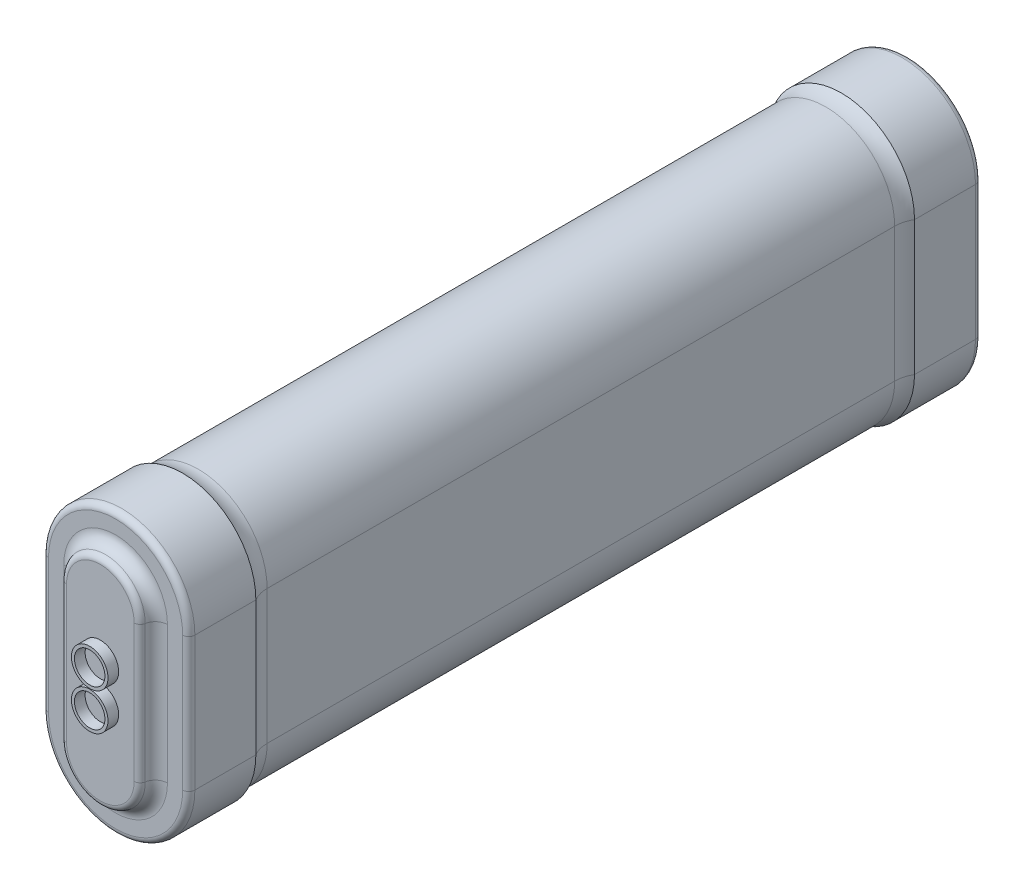
ISO-10303-21;
HEADER;
FILE_DESCRIPTION(('STEP AP214'),'2;1');
FILE_NAME('part.step','',(''),(''),'','','');
FILE_SCHEMA(('AUTOMOTIVE_DESIGN { 1 0 10303 214 1 1 1 1 }'));
ENDSEC;
DATA;
#1=APPLICATION_CONTEXT('core data for automotive mechanical design processes');
#2=APPLICATION_PROTOCOL_DEFINITION('international standard','automotive_design',2000,#1);
#3=PRODUCT_CONTEXT('',#1,'mechanical');
#4=PRODUCT('Part','Part','',(#3));
#5=PRODUCT_RELATED_PRODUCT_CATEGORY('part','',(#4));
#6=PRODUCT_DEFINITION_FORMATION('','',#4);
#7=PRODUCT_DEFINITION_CONTEXT('part definition',#1,'design');
#8=PRODUCT_DEFINITION('design','',#6,#7);
#9=PRODUCT_DEFINITION_SHAPE('','',#8);
#10=(LENGTH_UNIT() NAMED_UNIT(*) SI_UNIT(.MILLI.,.METRE.));
#11=(NAMED_UNIT(*) PLANE_ANGLE_UNIT() SI_UNIT($,.RADIAN.));
#12=(NAMED_UNIT(*) SI_UNIT($,.STERADIAN.) SOLID_ANGLE_UNIT());
#13=UNCERTAINTY_MEASURE_WITH_UNIT(LENGTH_MEASURE(1.E-05),#10,'distance_accuracy_value','');
#14=(GEOMETRIC_REPRESENTATION_CONTEXT(3) GLOBAL_UNCERTAINTY_ASSIGNED_CONTEXT((#13)) GLOBAL_UNIT_ASSIGNED_CONTEXT((#10,
#11,#12)) REPRESENTATION_CONTEXT('',''));
#15=CARTESIAN_POINT('',(0.,0.,0.));
#16=DIRECTION('',(0.,0.,1.));
#17=DIRECTION('',(1.,0.,0.));
#18=AXIS2_PLACEMENT_3D('',#15,#16,#17);
#19=CARTESIAN_POINT('',(0.,-11.25,67.5));
#20=DIRECTION('',(0.,0.,-1.));
#21=DIRECTION('',(-1.,0.,0.));
#22=AXIS2_PLACEMENT_3D('',#19,#20,#21);
#23=PLANE('',#22);
#24=CARTESIAN_POINT('',(0.,11.25,67.5));
#25=DIRECTION('',(0.,0.,-1.));
#26=DIRECTION('',(-1.,0.,0.));
#27=AXIS2_PLACEMENT_3D('',#24,#25,#26);
#28=CIRCLE('',#27,5.54196010845019);
#29=CARTESIAN_POINT('',(5.54196010845019,11.25,67.5));
#30=VERTEX_POINT('',#29);
#31=CARTESIAN_POINT('',(-5.54196010845019,11.25,67.5));
#32=VERTEX_POINT('',#31);
#33=EDGE_CURVE('E342',#30,#32,#28,.F.);
#34=ORIENTED_EDGE('',*,*,#33,.T.);
#35=DIRECTION('',(0.,1.,0.));
#36=VECTOR('',#35,1.);
#37=CARTESIAN_POINT('',(-5.54196010845019,-11.25,67.5));
#38=LINE('',#37,#36);
#39=CARTESIAN_POINT('',(-5.54196010845019,-11.25,67.5));
#40=VERTEX_POINT('',#39);
#41=EDGE_CURVE('E344',#32,#40,#38,.F.);
#42=ORIENTED_EDGE('',*,*,#41,.T.);
#43=CARTESIAN_POINT('',(0.,-11.25,67.5));
#44=DIRECTION('',(0.,0.,-1.));
#45=DIRECTION('',(-1.,0.,0.));
#46=AXIS2_PLACEMENT_3D('',#43,#44,#45);
#47=CIRCLE('',#46,5.54196010845019);
#48=CARTESIAN_POINT('',(5.54196010845019,-11.25,67.5));
#49=VERTEX_POINT('',#48);
#50=EDGE_CURVE('E329',#40,#49,#47,.F.);
#51=ORIENTED_EDGE('',*,*,#50,.T.);
#52=DIRECTION('',(0.,-1.,0.));
#53=VECTOR('',#52,1.);
#54=CARTESIAN_POINT('',(5.54196010845019,-11.25,67.5));
#55=LINE('',#54,#53);
#56=EDGE_CURVE('E340',#49,#30,#55,.F.);
#57=ORIENTED_EDGE('',*,*,#56,.T.);
#58=EDGE_LOOP('',(#34,#42,#51,#57));
#59=FACE_BOUND('',#58,.T.);
#60=CARTESIAN_POINT('',(0.,3.05,67.5));
#61=DIRECTION('',(0.,0.,-1.));
#62=DIRECTION('',(-1.,0.,0.));
#63=AXIS2_PLACEMENT_3D('',#60,#61,#62);
#64=CIRCLE('',#63,3.);
#65=CARTESIAN_POINT('',(-3.,3.05,67.5));
#66=VERTEX_POINT('',#65);
#67=EDGE_CURVE('E40',#66,#66,#64,.F.);
#68=ORIENTED_EDGE('',*,*,#67,.F.);
#69=EDGE_LOOP('',(#68));
#70=FACE_BOUND('',#69,.T.);
#71=CARTESIAN_POINT('',(0.,-3.05,67.5));
#72=DIRECTION('',(0.,0.,-1.));
#73=DIRECTION('',(-1.,0.,0.));
#74=AXIS2_PLACEMENT_3D('',#71,#72,#73);
#75=CIRCLE('',#74,3.);
#76=CARTESIAN_POINT('',(-3.,-3.05,67.5));
#77=VERTEX_POINT('',#76);
#78=EDGE_CURVE('E11',#77,#77,#75,.F.);
#79=ORIENTED_EDGE('',*,*,#78,.F.);
#80=EDGE_LOOP('',(#79));
#81=FACE_BOUND('',#80,.T.);
#82=ADVANCED_FACE('F32',(#59,#70,#81),#23,.F.);
#83=CARTESIAN_POINT('',(0.,-11.,65.));
#84=DIRECTION('',(0.,0.,-1.));
#85=DIRECTION('',(-1.,0.,0.));
#86=AXIS2_PLACEMENT_3D('',#83,#84,#85);
#87=PLANE('',#86);
#88=CARTESIAN_POINT('',(0.,-11.25,65.));
#89=DIRECTION('',(0.,0.,-1.));
#90=DIRECTION('',(-1.,0.,0.));
#91=AXIS2_PLACEMENT_3D('',#88,#89,#90);
#92=CIRCLE('',#91,8.5);
#93=CARTESIAN_POINT('',(8.5,-11.25,65.));
#94=VERTEX_POINT('',#93);
#95=CARTESIAN_POINT('',(-8.5,-11.25,65.));
#96=VERTEX_POINT('',#95);
#97=EDGE_CURVE('E324',#94,#96,#92,.T.);
#98=ORIENTED_EDGE('',*,*,#97,.T.);
#99=DIRECTION('',(0.,-1.,0.));
#100=VECTOR('',#99,1.);
#101=CARTESIAN_POINT('',(-8.5,11.25,65.));
#102=LINE('',#101,#100);
#103=CARTESIAN_POINT('',(-8.5,11.25,65.));
#104=VERTEX_POINT('',#103);
#105=EDGE_CURVE('E326',#96,#104,#102,.F.);
#106=ORIENTED_EDGE('',*,*,#105,.T.);
#107=CARTESIAN_POINT('',(0.,11.25,65.));
#108=DIRECTION('',(0.,0.,-1.));
#109=DIRECTION('',(-1.,0.,0.));
#110=AXIS2_PLACEMENT_3D('',#107,#108,#109);
#111=CIRCLE('',#110,8.5);
#112=CARTESIAN_POINT('',(8.5,11.25,65.));
#113=VERTEX_POINT('',#112);
#114=EDGE_CURVE('E321',#104,#113,#111,.T.);
#115=ORIENTED_EDGE('',*,*,#114,.T.);
#116=DIRECTION('',(0.,1.,0.));
#117=VECTOR('',#116,1.);
#118=CARTESIAN_POINT('',(8.5,-11.25,65.));
#119=LINE('',#118,#117);
#120=EDGE_CURVE('E299',#113,#94,#119,.F.);
#121=ORIENTED_EDGE('',*,*,#120,.T.);
#122=EDGE_LOOP('',(#98,#106,#115,#121));
#123=FACE_BOUND('',#122,.T.);
#124=CARTESIAN_POINT('',(0.,11.,65.));
#125=DIRECTION('',(0.,0.,-1.));
#126=DIRECTION('',(-1.,0.,0.));
#127=AXIS2_PLACEMENT_3D('',#124,#125,#126);
#128=CIRCLE('',#127,11.);
#129=CARTESIAN_POINT('',(11.,11.,65.));
#130=VERTEX_POINT('',#129);
#131=CARTESIAN_POINT('',(-11.,11.,65.));
#132=VERTEX_POINT('',#131);
#133=EDGE_CURVE('E283',#130,#132,#128,.F.);
#134=ORIENTED_EDGE('',*,*,#133,.T.);
#135=DIRECTION('',(0.,-1.,0.));
#136=VECTOR('',#135,1.);
#137=CARTESIAN_POINT('',(-11.,-11.,65.));
#138=LINE('',#137,#136);
#139=CARTESIAN_POINT('',(-11.,-11.,65.));
#140=VERTEX_POINT('',#139);
#141=EDGE_CURVE('E289',#132,#140,#138,.T.);
#142=ORIENTED_EDGE('',*,*,#141,.T.);
#143=CARTESIAN_POINT('',(0.,-11.,65.));
#144=DIRECTION('',(0.,0.,-1.));
#145=DIRECTION('',(-1.,0.,0.));
#146=AXIS2_PLACEMENT_3D('',#143,#144,#145);
#147=CIRCLE('',#146,11.);
#148=CARTESIAN_POINT('',(11.,-11.,65.));
#149=VERTEX_POINT('',#148);
#150=EDGE_CURVE('E287',#140,#149,#147,.F.);
#151=ORIENTED_EDGE('',*,*,#150,.T.);
#152=DIRECTION('',(0.,1.,0.));
#153=VECTOR('',#152,1.);
#154=CARTESIAN_POINT('',(11.,-11.,65.));
#155=LINE('',#154,#153);
#156=EDGE_CURVE('E285',#149,#130,#155,.T.);
#157=ORIENTED_EDGE('',*,*,#156,.T.);
#158=EDGE_LOOP('',(#134,#142,#151,#157));
#159=FACE_BOUND('',#158,.T.);
#160=ADVANCED_FACE('F370',(#123,#159),#87,.F.);
#161=CARTESIAN_POINT('',(0.,-11.,65.));
#162=DIRECTION('',(0.,0.,-1.));
#163=DIRECTION('',(-1.,0.,0.));
#164=AXIS2_PLACEMENT_3D('',#161,#162,#163);
#165=CYLINDRICAL_SURFACE('',#164,12.);
#166=DIRECTION('',(0.,0.,-1.));
#167=VECTOR('',#166,1.);
#168=CARTESIAN_POINT('',(-12.,-11.,65.));
#169=LINE('',#168,#167);
#170=CARTESIAN_POINT('',(-12.,-11.,-54.));
#171=VERTEX_POINT('',#170);
#172=CARTESIAN_POINT('',(-12.,-11.,-64.));
#173=VERTEX_POINT('',#172);
#174=EDGE_CURVE('E578',#171,#173,#169,.T.);
#175=ORIENTED_EDGE('',*,*,#174,.T.);
#176=CARTESIAN_POINT('',(0.,-11.,-64.));
#177=DIRECTION('',(0.,0.,-1.));
#178=DIRECTION('',(-1.,0.,0.));
#179=AXIS2_PLACEMENT_3D('',#176,#177,#178);
#180=CIRCLE('',#179,12.);
#181=CARTESIAN_POINT('',(12.,-11.,-64.));
#182=VERTEX_POINT('',#181);
#183=EDGE_CURVE('E249',#173,#182,#180,.F.);
#184=ORIENTED_EDGE('',*,*,#183,.T.);
#185=DIRECTION('',(0.,0.,-1.));
#186=VECTOR('',#185,1.);
#187=CARTESIAN_POINT('',(12.,-11.,65.));
#188=LINE('',#187,#186);
#189=CARTESIAN_POINT('',(12.,-11.,-54.));
#190=VERTEX_POINT('',#189);
#191=EDGE_CURVE('E229',#190,#182,#188,.T.);
#192=ORIENTED_EDGE('',*,*,#191,.F.);
#193=CARTESIAN_POINT('',(0.,-11.,-54.));
#194=DIRECTION('',(0.,0.,-1.));
#195=DIRECTION('',(-1.,0.,0.));
#196=AXIS2_PLACEMENT_3D('',#193,#194,#195);
#197=CIRCLE('',#196,12.);
#198=EDGE_CURVE('E576',#190,#171,#197,.T.);
#199=ORIENTED_EDGE('',*,*,#198,.T.);
#200=EDGE_LOOP('',(#175,#184,#192,#199));
#201=FACE_BOUND('',#200,.T.);
#202=ADVANCED_FACE('F426',(#201),#165,.T.);
#203=CARTESIAN_POINT('',(12.,11.,65.));
#204=DIRECTION('',(-1.,0.,0.));
#205=DIRECTION('',(0.,0.,1.));
#206=AXIS2_PLACEMENT_3D('',#203,#204,#205);
#207=PLANE('',#206);
#208=ORIENTED_EDGE('',*,*,#191,.T.);
#209=DIRECTION('',(0.,1.,0.));
#210=VECTOR('',#209,1.);
#211=CARTESIAN_POINT('',(12.,11.,-64.));
#212=LINE('',#211,#210);
#213=CARTESIAN_POINT('',(12.,11.,-64.));
#214=VERTEX_POINT('',#213);
#215=EDGE_CURVE('E277',#182,#214,#212,.T.);
#216=ORIENTED_EDGE('',*,*,#215,.T.);
#217=DIRECTION('',(0.,0.,-1.));
#218=VECTOR('',#217,1.);
#219=CARTESIAN_POINT('',(12.,11.,65.));
#220=LINE('',#219,#218);
#221=CARTESIAN_POINT('',(12.,11.,-54.));
#222=VERTEX_POINT('',#221);
#223=EDGE_CURVE('E194',#222,#214,#220,.T.);
#224=ORIENTED_EDGE('',*,*,#223,.F.);
#225=DIRECTION('',(0.,-1.,0.));
#226=VECTOR('',#225,1.);
#227=CARTESIAN_POINT('',(12.,11.,-54.));
#228=LINE('',#227,#226);
#229=EDGE_CURVE('E570',#222,#190,#228,.T.);
#230=ORIENTED_EDGE('',*,*,#229,.T.);
#231=EDGE_LOOP('',(#208,#216,#224,#230));
#232=FACE_BOUND('',#231,.T.);
#233=ADVANCED_FACE('F438',(#232),#207,.F.);
#234=CARTESIAN_POINT('',(0.,11.,65.));
#235=DIRECTION('',(0.,0.,-1.));
#236=DIRECTION('',(-1.,0.,0.));
#237=AXIS2_PLACEMENT_3D('',#234,#235,#236);
#238=CYLINDRICAL_SURFACE('',#237,12.);
#239=ORIENTED_EDGE('',*,*,#223,.T.);
#240=CARTESIAN_POINT('',(0.,11.,-64.));
#241=DIRECTION('',(0.,0.,-1.));
#242=DIRECTION('',(-1.,0.,0.));
#243=AXIS2_PLACEMENT_3D('',#240,#241,#242);
#244=CIRCLE('',#243,12.);
#245=CARTESIAN_POINT('',(-12.,11.,-64.));
#246=VERTEX_POINT('',#245);
#247=EDGE_CURVE('E279',#214,#246,#244,.F.);
#248=ORIENTED_EDGE('',*,*,#247,.T.);
#249=DIRECTION('',(0.,0.,-1.));
#250=VECTOR('',#249,1.);
#251=CARTESIAN_POINT('',(-12.,11.,65.));
#252=LINE('',#251,#250);
#253=CARTESIAN_POINT('',(-12.,11.,-54.));
#254=VERTEX_POINT('',#253);
#255=EDGE_CURVE('E195',#254,#246,#252,.T.);
#256=ORIENTED_EDGE('',*,*,#255,.F.);
#257=CARTESIAN_POINT('',(0.,11.,-54.));
#258=DIRECTION('',(0.,0.,-1.));
#259=DIRECTION('',(-1.,0.,0.));
#260=AXIS2_PLACEMENT_3D('',#257,#258,#259);
#261=CIRCLE('',#260,12.);
#262=EDGE_CURVE('E568',#254,#222,#261,.T.);
#263=ORIENTED_EDGE('',*,*,#262,.T.);
#264=EDGE_LOOP('',(#239,#248,#256,#263));
#265=FACE_BOUND('',#264,.T.);
#266=ADVANCED_FACE('F434',(#265),#238,.T.);
#267=CARTESIAN_POINT('',(-12.,-11.,65.));
#268=DIRECTION('',(1.,0.,0.));
#269=DIRECTION('',(0.,0.,-1.));
#270=AXIS2_PLACEMENT_3D('',#267,#268,#269);
#271=PLANE('',#270);
#272=ORIENTED_EDGE('',*,*,#255,.T.);
#273=DIRECTION('',(0.,-1.,0.));
#274=VECTOR('',#273,1.);
#275=CARTESIAN_POINT('',(-12.,-11.,-64.));
#276=LINE('',#275,#274);
#277=EDGE_CURVE('E281',#246,#173,#276,.T.);
#278=ORIENTED_EDGE('',*,*,#277,.T.);
#279=ORIENTED_EDGE('',*,*,#174,.F.);
#280=DIRECTION('',(0.,1.,0.));
#281=VECTOR('',#280,1.);
#282=CARTESIAN_POINT('',(-12.,-11.,-54.));
#283=LINE('',#282,#281);
#284=EDGE_CURVE('E223',#171,#254,#283,.T.);
#285=ORIENTED_EDGE('',*,*,#284,.T.);
#286=EDGE_LOOP('',(#272,#278,#279,#285));
#287=FACE_BOUND('',#286,.T.);
#288=ADVANCED_FACE('F430',(#287),#271,.F.);
#289=CARTESIAN_POINT('',(0.,-11.,-65.));
#290=DIRECTION('',(0.,0.,-1.));
#291=DIRECTION('',(-1.,0.,0.));
#292=AXIS2_PLACEMENT_3D('',#289,#290,#291);
#293=PLANE('',#292);
#294=DIRECTION('',(0.,1.,0.));
#295=VECTOR('',#294,1.);
#296=CARTESIAN_POINT('',(11.,-11.,-65.));
#297=LINE('',#296,#295);
#298=CARTESIAN_POINT('',(11.,11.,-65.));
#299=VERTEX_POINT('',#298);
#300=CARTESIAN_POINT('',(11.,-11.,-65.));
#301=VERTEX_POINT('',#300);
#302=EDGE_CURVE('E272',#299,#301,#297,.F.);
#303=ORIENTED_EDGE('',*,*,#302,.T.);
#304=CARTESIAN_POINT('',(0.,-11.,-65.));
#305=DIRECTION('',(0.,0.,-1.));
#306=DIRECTION('',(-1.,0.,0.));
#307=AXIS2_PLACEMENT_3D('',#304,#305,#306);
#308=CIRCLE('',#307,11.);
#309=CARTESIAN_POINT('',(-11.,-11.,-65.));
#310=VERTEX_POINT('',#309);
#311=EDGE_CURVE('E274',#301,#310,#308,.T.);
#312=ORIENTED_EDGE('',*,*,#311,.T.);
#313=DIRECTION('',(0.,-1.,0.));
#314=VECTOR('',#313,1.);
#315=CARTESIAN_POINT('',(-11.,11.,-65.));
#316=LINE('',#315,#314);
#317=CARTESIAN_POINT('',(-11.,11.,-65.));
#318=VERTEX_POINT('',#317);
#319=EDGE_CURVE('E268',#310,#318,#316,.F.);
#320=ORIENTED_EDGE('',*,*,#319,.T.);
#321=CARTESIAN_POINT('',(0.,11.,-65.));
#322=DIRECTION('',(0.,0.,-1.));
#323=DIRECTION('',(-1.,0.,0.));
#324=AXIS2_PLACEMENT_3D('',#321,#322,#323);
#325=CIRCLE('',#324,11.);
#326=EDGE_CURVE('E270',#318,#299,#325,.T.);
#327=ORIENTED_EDGE('',*,*,#326,.T.);
#328=EDGE_LOOP('',(#303,#312,#320,#327));
#329=FACE_BOUND('',#328,.T.);
#330=ADVANCED_FACE('F422',(#329),#293,.T.);
#331=CARTESIAN_POINT('',(0.,11.,-54.));
#332=DIRECTION('',(0.,0.,1.));
#333=DIRECTION('',(1.,0.,0.));
#334=AXIS2_PLACEMENT_3D('',#331,#332,#333);
#335=CYLINDRICAL_SURFACE('',#334,11.3);
#336=DIRECTION('',(0.,0.,1.));
#337=VECTOR('',#336,1.);
#338=CARTESIAN_POINT('',(-11.3,11.,-54.));
#339=LINE('',#338,#337);
#340=CARTESIAN_POINT('',(-11.3,11.,-51.4485298355654));
#341=VERTEX_POINT('',#340);
#342=CARTESIAN_POINT('',(-11.3,11.,51.4485298355654));
#343=VERTEX_POINT('',#342);
#344=EDGE_CURVE('E217',#341,#343,#339,.T.);
#345=ORIENTED_EDGE('',*,*,#344,.T.);
#346=CARTESIAN_POINT('',(0.,11.,51.4485298355654));
#347=DIRECTION('',(0.,0.,1.));
#348=DIRECTION('',(1.,0.,0.));
#349=AXIS2_PLACEMENT_3D('',#346,#347,#348);
#350=CIRCLE('',#349,11.3);
#351=CARTESIAN_POINT('',(11.3,11.,51.4485298355654));
#352=VERTEX_POINT('',#351);
#353=EDGE_CURVE('E214',#343,#352,#350,.F.);
#354=ORIENTED_EDGE('',*,*,#353,.T.);
#355=DIRECTION('',(0.,0.,1.));
#356=VECTOR('',#355,1.);
#357=CARTESIAN_POINT('',(11.3,11.,-54.));
#358=LINE('',#357,#356);
#359=CARTESIAN_POINT('',(11.3,11.,-51.4485298355654));
#360=VERTEX_POINT('',#359);
#361=EDGE_CURVE('E208',#360,#352,#358,.T.);
#362=ORIENTED_EDGE('',*,*,#361,.F.);
#363=CARTESIAN_POINT('',(0.,11.,-51.4485298355654));
#364=DIRECTION('',(0.,0.,-1.));
#365=DIRECTION('',(-1.,0.,0.));
#366=AXIS2_PLACEMENT_3D('',#363,#364,#365);
#367=CIRCLE('',#366,11.3);
#368=EDGE_CURVE('E241',#360,#341,#367,.F.);
#369=ORIENTED_EDGE('',*,*,#368,.T.);
#370=EDGE_LOOP('',(#345,#354,#362,#369));
#371=FACE_BOUND('',#370,.T.);
#372=ADVANCED_FACE('F411',(#371),#335,.T.);
#373=CARTESIAN_POINT('',(11.3,-11.,-54.));
#374=DIRECTION('',(1.,0.,0.));
#375=DIRECTION('',(0.,0.,-1.));
#376=AXIS2_PLACEMENT_3D('',#373,#374,#375);
#377=PLANE('',#376);
#378=ORIENTED_EDGE('',*,*,#361,.T.);
#379=DIRECTION('',(0.,-1.,0.));
#380=VECTOR('',#379,1.);
#381=CARTESIAN_POINT('',(11.3,-11.,51.4485298355654));
#382=LINE('',#381,#380);
#383=CARTESIAN_POINT('',(11.3,-11.,51.4485298355654));
#384=VERTEX_POINT('',#383);
#385=EDGE_CURVE('E239',#352,#384,#382,.T.);
#386=ORIENTED_EDGE('',*,*,#385,.T.);
#387=DIRECTION('',(0.,0.,1.));
#388=VECTOR('',#387,1.);
#389=CARTESIAN_POINT('',(11.3,-11.,-54.));
#390=LINE('',#389,#388);
#391=CARTESIAN_POINT('',(11.3,-11.,-51.4485298355654));
#392=VERTEX_POINT('',#391);
#393=EDGE_CURVE('E615',#392,#384,#390,.T.);
#394=ORIENTED_EDGE('',*,*,#393,.F.);
#395=DIRECTION('',(0.,-1.,0.));
#396=VECTOR('',#395,1.);
#397=CARTESIAN_POINT('',(11.3,11.,-51.4485298355654));
#398=LINE('',#397,#396);
#399=EDGE_CURVE('E237',#392,#360,#398,.F.);
#400=ORIENTED_EDGE('',*,*,#399,.T.);
#401=EDGE_LOOP('',(#378,#386,#394,#400));
#402=FACE_BOUND('',#401,.T.);
#403=ADVANCED_FACE('F407',(#402),#377,.T.);
#404=CARTESIAN_POINT('',(0.,-11.,-54.));
#405=DIRECTION('',(0.,0.,1.));
#406=DIRECTION('',(1.,0.,0.));
#407=AXIS2_PLACEMENT_3D('',#404,#405,#406);
#408=CYLINDRICAL_SURFACE('',#407,11.3);
#409=ORIENTED_EDGE('',*,*,#393,.T.);
#410=CARTESIAN_POINT('',(0.,-11.,51.4485298355654));
#411=DIRECTION('',(0.,0.,1.));
#412=DIRECTION('',(1.,0.,0.));
#413=AXIS2_PLACEMENT_3D('',#410,#411,#412);
#414=CIRCLE('',#413,11.3);
#415=CARTESIAN_POINT('',(-11.3,-11.,51.4485298355654));
#416=VERTEX_POINT('',#415);
#417=EDGE_CURVE('E234',#384,#416,#414,.F.);
#418=ORIENTED_EDGE('',*,*,#417,.T.);
#419=DIRECTION('',(0.,0.,1.));
#420=VECTOR('',#419,1.);
#421=CARTESIAN_POINT('',(-11.3,-11.,-54.));
#422=LINE('',#421,#420);
#423=CARTESIAN_POINT('',(-11.3,-11.,-51.4485298355654));
#424=VERTEX_POINT('',#423);
#425=EDGE_CURVE('E619',#424,#416,#422,.T.);
#426=ORIENTED_EDGE('',*,*,#425,.F.);
#427=CARTESIAN_POINT('',(0.,-11.,-51.4485298355654));
#428=DIRECTION('',(0.,0.,-1.));
#429=DIRECTION('',(-1.,0.,0.));
#430=AXIS2_PLACEMENT_3D('',#427,#428,#429);
#431=CIRCLE('',#430,11.3);
#432=EDGE_CURVE('E227',#424,#392,#431,.F.);
#433=ORIENTED_EDGE('',*,*,#432,.T.);
#434=EDGE_LOOP('',(#409,#418,#426,#433));
#435=FACE_BOUND('',#434,.T.);
#436=ADVANCED_FACE('F410',(#435),#408,.T.);
#437=CARTESIAN_POINT('',(-11.3,11.,-54.));
#438=DIRECTION('',(-1.,0.,0.));
#439=DIRECTION('',(0.,0.,1.));
#440=AXIS2_PLACEMENT_3D('',#437,#438,#439);
#441=PLANE('',#440);
#442=ORIENTED_EDGE('',*,*,#425,.T.);
#443=DIRECTION('',(0.,1.,0.));
#444=VECTOR('',#443,1.);
#445=CARTESIAN_POINT('',(-11.3,11.,51.4485298355654));
#446=LINE('',#445,#444);
#447=EDGE_CURVE('E247',#416,#343,#446,.T.);
#448=ORIENTED_EDGE('',*,*,#447,.T.);
#449=ORIENTED_EDGE('',*,*,#344,.F.);
#450=DIRECTION('',(0.,1.,0.));
#451=VECTOR('',#450,1.);
#452=CARTESIAN_POINT('',(-11.3,-11.,-51.4485298355654));
#453=LINE('',#452,#451);
#454=EDGE_CURVE('E244',#341,#424,#453,.F.);
#455=ORIENTED_EDGE('',*,*,#454,.T.);
#456=EDGE_LOOP('',(#442,#448,#449,#455));
#457=FACE_BOUND('',#456,.T.);
#458=ADVANCED_FACE('F415',(#457),#441,.T.);
#459=CARTESIAN_POINT('',(-12.,-11.,64.));
#460=VERTEX_POINT('',#459);
#461=CARTESIAN_POINT('',(-12.,-11.,54.));
#462=VERTEX_POINT('',#461);
#463=EDGE_CURVE('E567',#460,#462,#169,.T.);
#464=ORIENTED_EDGE('',*,*,#463,.F.);
#465=DIRECTION('',(0.,-1.,0.));
#466=VECTOR('',#465,1.);
#467=CARTESIAN_POINT('',(-12.,-11.,64.));
#468=LINE('',#467,#466);
#469=CARTESIAN_POINT('',(-12.,11.,64.));
#470=VERTEX_POINT('',#469);
#471=EDGE_CURVE('E192',#460,#470,#468,.F.);
#472=ORIENTED_EDGE('',*,*,#471,.T.);
#473=CARTESIAN_POINT('',(-12.,11.,54.));
#474=VERTEX_POINT('',#473);
#475=EDGE_CURVE('E184',#470,#474,#252,.T.);
#476=ORIENTED_EDGE('',*,*,#475,.T.);
#477=DIRECTION('',(0.,1.,0.));
#478=VECTOR('',#477,1.);
#479=CARTESIAN_POINT('',(-12.,-11.,54.));
#480=LINE('',#479,#478);
#481=EDGE_CURVE('E189',#462,#474,#480,.T.);
#482=ORIENTED_EDGE('',*,*,#481,.F.);
#483=EDGE_LOOP('',(#464,#472,#476,#482));
#484=FACE_BOUND('',#483,.T.);
#485=ADVANCED_FACE('F187',(#484),#271,.F.);
#486=ORIENTED_EDGE('',*,*,#475,.F.);
#487=CARTESIAN_POINT('',(0.,11.,64.));
#488=DIRECTION('',(0.,0.,-1.));
#489=DIRECTION('',(-1.,0.,0.));
#490=AXIS2_PLACEMENT_3D('',#487,#488,#489);
#491=CIRCLE('',#490,12.);
#492=CARTESIAN_POINT('',(12.,11.,64.));
#493=VERTEX_POINT('',#492);
#494=EDGE_CURVE('E297',#470,#493,#491,.T.);
#495=ORIENTED_EDGE('',*,*,#494,.T.);
#496=CARTESIAN_POINT('',(12.,11.,54.));
#497=VERTEX_POINT('',#496);
#498=EDGE_CURVE('E202',#493,#497,#220,.T.);
#499=ORIENTED_EDGE('',*,*,#498,.T.);
#500=CARTESIAN_POINT('',(0.,11.,54.));
#501=DIRECTION('',(0.,0.,-1.));
#502=DIRECTION('',(-1.,0.,0.));
#503=AXIS2_PLACEMENT_3D('',#500,#501,#502);
#504=CIRCLE('',#503,12.);
#505=EDGE_CURVE('E198',#474,#497,#504,.T.);
#506=ORIENTED_EDGE('',*,*,#505,.F.);
#507=EDGE_LOOP('',(#486,#495,#499,#506));
#508=FACE_BOUND('',#507,.T.);
#509=ADVANCED_FACE('F200',(#508),#238,.T.);
#510=ORIENTED_EDGE('',*,*,#498,.F.);
#511=DIRECTION('',(0.,1.,0.));
#512=VECTOR('',#511,1.);
#513=CARTESIAN_POINT('',(12.,11.,64.));
#514=LINE('',#513,#512);
#515=CARTESIAN_POINT('',(12.,-11.,64.));
#516=VERTEX_POINT('',#515);
#517=EDGE_CURVE('E295',#493,#516,#514,.F.);
#518=ORIENTED_EDGE('',*,*,#517,.T.);
#519=CARTESIAN_POINT('',(12.,-11.,54.));
#520=VERTEX_POINT('',#519);
#521=EDGE_CURVE('E224',#516,#520,#188,.T.);
#522=ORIENTED_EDGE('',*,*,#521,.T.);
#523=DIRECTION('',(0.,-1.,0.));
#524=VECTOR('',#523,1.);
#525=CARTESIAN_POINT('',(12.,11.,54.));
#526=LINE('',#525,#524);
#527=EDGE_CURVE('E207',#497,#520,#526,.T.);
#528=ORIENTED_EDGE('',*,*,#527,.F.);
#529=EDGE_LOOP('',(#510,#518,#522,#528));
#530=FACE_BOUND('',#529,.T.);
#531=ADVANCED_FACE('F443',(#530),#207,.F.);
#532=ORIENTED_EDGE('',*,*,#521,.F.);
#533=CARTESIAN_POINT('',(0.,-11.,64.));
#534=DIRECTION('',(0.,0.,-1.));
#535=DIRECTION('',(-1.,0.,0.));
#536=AXIS2_PLACEMENT_3D('',#533,#534,#535);
#537=CIRCLE('',#536,12.);
#538=EDGE_CURVE('E293',#516,#460,#537,.T.);
#539=ORIENTED_EDGE('',*,*,#538,.T.);
#540=ORIENTED_EDGE('',*,*,#463,.T.);
#541=CARTESIAN_POINT('',(0.,-11.,54.));
#542=DIRECTION('',(0.,0.,-1.));
#543=DIRECTION('',(-1.,0.,0.));
#544=AXIS2_PLACEMENT_3D('',#541,#542,#543);
#545=CIRCLE('',#544,12.);
#546=EDGE_CURVE('E566',#520,#462,#545,.T.);
#547=ORIENTED_EDGE('',*,*,#546,.F.);
#548=EDGE_LOOP('',(#532,#539,#540,#547));
#549=FACE_BOUND('',#548,.T.);
#550=ADVANCED_FACE('F447',(#549),#165,.T.);
#551=CARTESIAN_POINT('',(0.,11.,51.4485298355654));
#552=DIRECTION('',(0.,0.,1.));
#553=DIRECTION('',(1.,0.,0.));
#554=AXIS2_PLACEMENT_3D('',#551,#552,#553);
#555=TOROIDAL_SURFACE('',#554,16.3,5.);
#556=CARTESIAN_POINT('',(16.3,11.,51.4485298355654));
#557=DIRECTION('',(0.,1.,0.));
#558=DIRECTION('',(0.,0.,1.));
#559=AXIS2_PLACEMENT_3D('',#556,#557,#558);
#560=CIRCLE('',#559,5.);
#561=EDGE_CURVE('E218',#352,#497,#560,.T.);
#562=ORIENTED_EDGE('',*,*,#561,.F.);
#563=ORIENTED_EDGE('',*,*,#353,.F.);
#564=CARTESIAN_POINT('',(-16.3,11.,51.4485298355654));
#565=DIRECTION('',(0.,1.,0.));
#566=DIRECTION('',(0.,0.,1.));
#567=AXIS2_PLACEMENT_3D('',#564,#565,#566);
#568=CIRCLE('',#567,5.);
#569=EDGE_CURVE('E212',#474,#343,#568,.T.);
#570=ORIENTED_EDGE('',*,*,#569,.F.);
#571=ORIENTED_EDGE('',*,*,#505,.T.);
#572=EDGE_LOOP('',(#562,#563,#570,#571));
#573=FACE_BOUND('',#572,.T.);
#574=ADVANCED_FACE('F213',(#573),#555,.F.);
#575=CARTESIAN_POINT('',(-16.3,11.,51.4485298355654));
#576=DIRECTION('',(0.,-1.,0.));
#577=DIRECTION('',(0.,0.,-1.));
#578=AXIS2_PLACEMENT_3D('',#575,#576,#577);
#579=CYLINDRICAL_SURFACE('',#578,5.);
#580=ORIENTED_EDGE('',*,*,#569,.T.);
#581=ORIENTED_EDGE('',*,*,#447,.F.);
#582=CARTESIAN_POINT('',(-16.3,-11.,51.4485298355654));
#583=DIRECTION('',(0.,1.,0.));
#584=DIRECTION('',(0.,0.,1.));
#585=AXIS2_PLACEMENT_3D('',#582,#583,#584);
#586=CIRCLE('',#585,5.);
#587=EDGE_CURVE('E221',#462,#416,#586,.T.);
#588=ORIENTED_EDGE('',*,*,#587,.F.);
#589=ORIENTED_EDGE('',*,*,#481,.T.);
#590=EDGE_LOOP('',(#580,#581,#588,#589));
#591=FACE_BOUND('',#590,.T.);
#592=ADVANCED_FACE('F220',(#591),#579,.F.);
#593=CARTESIAN_POINT('',(16.3,11.,51.4485298355654));
#594=DIRECTION('',(0.,1.,0.));
#595=DIRECTION('',(0.,0.,1.));
#596=AXIS2_PLACEMENT_3D('',#593,#594,#595);
#597=CYLINDRICAL_SURFACE('',#596,5.);
#598=ORIENTED_EDGE('',*,*,#561,.T.);
#599=ORIENTED_EDGE('',*,*,#527,.T.);
#600=CARTESIAN_POINT('',(16.3,-11.,51.4485298355654));
#601=DIRECTION('',(0.,1.,0.));
#602=DIRECTION('',(0.,0.,1.));
#603=AXIS2_PLACEMENT_3D('',#600,#601,#602);
#604=CIRCLE('',#603,5.);
#605=EDGE_CURVE('E250',#384,#520,#604,.T.);
#606=ORIENTED_EDGE('',*,*,#605,.F.);
#607=ORIENTED_EDGE('',*,*,#385,.F.);
#608=EDGE_LOOP('',(#598,#599,#606,#607));
#609=FACE_BOUND('',#608,.T.);
#610=ADVANCED_FACE('F452',(#609),#597,.F.);
#611=CARTESIAN_POINT('',(0.,-11.,51.4485298355654));
#612=DIRECTION('',(0.,0.,1.));
#613=DIRECTION('',(1.,0.,0.));
#614=AXIS2_PLACEMENT_3D('',#611,#612,#613);
#615=TOROIDAL_SURFACE('',#614,16.3,5.);
#616=ORIENTED_EDGE('',*,*,#587,.T.);
#617=ORIENTED_EDGE('',*,*,#417,.F.);
#618=ORIENTED_EDGE('',*,*,#605,.T.);
#619=ORIENTED_EDGE('',*,*,#546,.T.);
#620=EDGE_LOOP('',(#616,#617,#618,#619));
#621=FACE_BOUND('',#620,.T.);
#622=ADVANCED_FACE('F448',(#621),#615,.F.);
#623=CARTESIAN_POINT('',(16.3,11.,-51.4485298355654));
#624=DIRECTION('',(0.,1.,0.));
#625=DIRECTION('',(0.,0.,1.));
#626=AXIS2_PLACEMENT_3D('',#623,#624,#625);
#627=CYLINDRICAL_SURFACE('',#626,5.);
#628=CARTESIAN_POINT('',(16.3,-11.,-51.4485298355654));
#629=DIRECTION('',(0.,1.,0.));
#630=DIRECTION('',(0.,0.,1.));
#631=AXIS2_PLACEMENT_3D('',#628,#629,#630);
#632=CIRCLE('',#631,5.);
#633=EDGE_CURVE('E261',#190,#392,#632,.T.);
#634=ORIENTED_EDGE('',*,*,#633,.F.);
#635=ORIENTED_EDGE('',*,*,#229,.F.);
#636=CARTESIAN_POINT('',(16.3,11.,-51.4485298355654));
#637=DIRECTION('',(0.,-1.,0.));
#638=DIRECTION('',(0.,0.,-1.));
#639=AXIS2_PLACEMENT_3D('',#636,#637,#638);
#640=CIRCLE('',#639,5.);
#641=EDGE_CURVE('E253',#360,#222,#640,.T.);
#642=ORIENTED_EDGE('',*,*,#641,.F.);
#643=ORIENTED_EDGE('',*,*,#399,.F.);
#644=EDGE_LOOP('',(#634,#635,#642,#643));
#645=FACE_BOUND('',#644,.T.);
#646=ADVANCED_FACE('F451',(#645),#627,.F.);
#647=CARTESIAN_POINT('',(0.,11.,-51.4485298355654));
#648=DIRECTION('',(0.,0.,-1.));
#649=DIRECTION('',(-1.,0.,0.));
#650=AXIS2_PLACEMENT_3D('',#647,#648,#649);
#651=TOROIDAL_SURFACE('',#650,16.3,5.);
#652=ORIENTED_EDGE('',*,*,#641,.T.);
#653=ORIENTED_EDGE('',*,*,#262,.F.);
#654=CARTESIAN_POINT('',(-16.3,11.,-51.4485298355654));
#655=DIRECTION('',(0.,1.,0.));
#656=DIRECTION('',(0.,0.,1.));
#657=AXIS2_PLACEMENT_3D('',#654,#655,#656);
#658=CIRCLE('',#657,5.);
#659=EDGE_CURVE('E258',#341,#254,#658,.T.);
#660=ORIENTED_EDGE('',*,*,#659,.F.);
#661=ORIENTED_EDGE('',*,*,#368,.F.);
#662=EDGE_LOOP('',(#652,#653,#660,#661));
#663=FACE_BOUND('',#662,.T.);
#664=ADVANCED_FACE('F469',(#663),#651,.F.);
#665=CARTESIAN_POINT('',(0.,-11.,-51.4485298355654));
#666=DIRECTION('',(0.,0.,-1.));
#667=DIRECTION('',(-1.,0.,0.));
#668=AXIS2_PLACEMENT_3D('',#665,#666,#667);
#669=TOROIDAL_SURFACE('',#668,16.3,5.);
#670=ORIENTED_EDGE('',*,*,#633,.T.);
#671=ORIENTED_EDGE('',*,*,#432,.F.);
#672=CARTESIAN_POINT('',(-16.3,-11.,-51.4485298355654));
#673=DIRECTION('',(0.,-1.,0.));
#674=DIRECTION('',(0.,0.,-1.));
#675=AXIS2_PLACEMENT_3D('',#672,#673,#674);
#676=CIRCLE('',#675,5.);
#677=EDGE_CURVE('E256',#171,#424,#676,.T.);
#678=ORIENTED_EDGE('',*,*,#677,.F.);
#679=ORIENTED_EDGE('',*,*,#198,.F.);
#680=EDGE_LOOP('',(#670,#671,#678,#679));
#681=FACE_BOUND('',#680,.T.);
#682=ADVANCED_FACE('F465',(#681),#669,.F.);
#683=CARTESIAN_POINT('',(-16.3,11.,-51.4485298355654));
#684=DIRECTION('',(0.,-1.,0.));
#685=DIRECTION('',(0.,0.,-1.));
#686=AXIS2_PLACEMENT_3D('',#683,#684,#685);
#687=CYLINDRICAL_SURFACE('',#686,5.);
#688=ORIENTED_EDGE('',*,*,#659,.T.);
#689=ORIENTED_EDGE('',*,*,#284,.F.);
#690=ORIENTED_EDGE('',*,*,#677,.T.);
#691=ORIENTED_EDGE('',*,*,#454,.F.);
#692=EDGE_LOOP('',(#688,#689,#690,#691));
#693=FACE_BOUND('',#692,.T.);
#694=ADVANCED_FACE('F461',(#693),#687,.F.);
#695=CARTESIAN_POINT('',(0.,11.,-64.));
#696=DIRECTION('',(0.,0.,-1.));
#697=DIRECTION('',(-1.,0.,0.));
#698=AXIS2_PLACEMENT_3D('',#695,#696,#697);
#699=TOROIDAL_SURFACE('',#698,11.,1.);
#700=CARTESIAN_POINT('',(11.,11.,-64.));
#701=DIRECTION('',(0.,-1.,0.));
#702=DIRECTION('',(0.,0.,-1.));
#703=AXIS2_PLACEMENT_3D('',#700,#701,#702);
#704=CIRCLE('',#703,1.);
#705=EDGE_CURVE('E305',#299,#214,#704,.T.);
#706=ORIENTED_EDGE('',*,*,#705,.F.);
#707=ORIENTED_EDGE('',*,*,#326,.F.);
#708=CARTESIAN_POINT('',(-11.,11.,-64.));
#709=DIRECTION('',(0.,-1.,0.));
#710=DIRECTION('',(0.,0.,-1.));
#711=AXIS2_PLACEMENT_3D('',#708,#709,#710);
#712=CIRCLE('',#711,1.);
#713=EDGE_CURVE('E259',#246,#318,#712,.T.);
#714=ORIENTED_EDGE('',*,*,#713,.F.);
#715=ORIENTED_EDGE('',*,*,#247,.F.);
#716=EDGE_LOOP('',(#706,#707,#714,#715));
#717=FACE_BOUND('',#716,.T.);
#718=ADVANCED_FACE('F464',(#717),#699,.T.);
#719=CARTESIAN_POINT('',(-11.,-11.,-64.));
#720=DIRECTION('',(0.,1.,0.));
#721=DIRECTION('',(0.,0.,1.));
#722=AXIS2_PLACEMENT_3D('',#719,#720,#721);
#723=CYLINDRICAL_SURFACE('',#722,1.);
#724=ORIENTED_EDGE('',*,*,#713,.T.);
#725=ORIENTED_EDGE('',*,*,#319,.F.);
#726=CARTESIAN_POINT('',(-11.,-11.,-64.));
#727=DIRECTION('',(0.,-1.,0.));
#728=DIRECTION('',(0.,0.,-1.));
#729=AXIS2_PLACEMENT_3D('',#726,#727,#728);
#730=CIRCLE('',#729,1.);
#731=EDGE_CURVE('E302',#173,#310,#730,.T.);
#732=ORIENTED_EDGE('',*,*,#731,.F.);
#733=ORIENTED_EDGE('',*,*,#277,.F.);
#734=EDGE_LOOP('',(#724,#725,#732,#733));
#735=FACE_BOUND('',#734,.T.);
#736=ADVANCED_FACE('F485',(#735),#723,.T.);
#737=CARTESIAN_POINT('',(11.,11.,-64.));
#738=DIRECTION('',(0.,-1.,0.));
#739=DIRECTION('',(0.,0.,-1.));
#740=AXIS2_PLACEMENT_3D('',#737,#738,#739);
#741=CYLINDRICAL_SURFACE('',#740,1.);
#742=ORIENTED_EDGE('',*,*,#705,.T.);
#743=ORIENTED_EDGE('',*,*,#215,.F.);
#744=CARTESIAN_POINT('',(11.,-11.,-64.));
#745=DIRECTION('',(0.,-1.,0.));
#746=DIRECTION('',(0.,0.,-1.));
#747=AXIS2_PLACEMENT_3D('',#744,#745,#746);
#748=CIRCLE('',#747,1.);
#749=EDGE_CURVE('E300',#301,#182,#748,.T.);
#750=ORIENTED_EDGE('',*,*,#749,.F.);
#751=ORIENTED_EDGE('',*,*,#302,.F.);
#752=EDGE_LOOP('',(#742,#743,#750,#751));
#753=FACE_BOUND('',#752,.T.);
#754=ADVANCED_FACE('F481',(#753),#741,.T.);
#755=CARTESIAN_POINT('',(0.,-11.,-64.));
#756=DIRECTION('',(0.,0.,-1.));
#757=DIRECTION('',(-1.,0.,0.));
#758=AXIS2_PLACEMENT_3D('',#755,#756,#757);
#759=TOROIDAL_SURFACE('',#758,11.,1.);
#760=ORIENTED_EDGE('',*,*,#731,.T.);
#761=ORIENTED_EDGE('',*,*,#311,.F.);
#762=ORIENTED_EDGE('',*,*,#749,.T.);
#763=ORIENTED_EDGE('',*,*,#183,.F.);
#764=EDGE_LOOP('',(#760,#761,#762,#763));
#765=FACE_BOUND('',#764,.T.);
#766=ADVANCED_FACE('F477',(#765),#759,.T.);
#767=CARTESIAN_POINT('',(11.,-11.,64.));
#768=DIRECTION('',(0.,1.,0.));
#769=DIRECTION('',(0.,0.,1.));
#770=AXIS2_PLACEMENT_3D('',#767,#768,#769);
#771=CYLINDRICAL_SURFACE('',#770,1.);
#772=CARTESIAN_POINT('',(11.,-11.,64.));
#773=DIRECTION('',(0.,-1.,0.));
#774=DIRECTION('',(0.,0.,-1.));
#775=AXIS2_PLACEMENT_3D('',#772,#773,#774);
#776=CIRCLE('',#775,1.);
#777=EDGE_CURVE('E315',#516,#149,#776,.T.);
#778=ORIENTED_EDGE('',*,*,#777,.F.);
#779=ORIENTED_EDGE('',*,*,#517,.F.);
#780=CARTESIAN_POINT('',(11.,11.,64.));
#781=DIRECTION('',(0.,1.,0.));
#782=DIRECTION('',(0.,0.,1.));
#783=AXIS2_PLACEMENT_3D('',#780,#781,#782);
#784=CIRCLE('',#783,1.);
#785=EDGE_CURVE('E303',#130,#493,#784,.T.);
#786=ORIENTED_EDGE('',*,*,#785,.F.);
#787=ORIENTED_EDGE('',*,*,#156,.F.);
#788=EDGE_LOOP('',(#778,#779,#786,#787));
#789=FACE_BOUND('',#788,.T.);
#790=ADVANCED_FACE('F480',(#789),#771,.T.);
#791=CARTESIAN_POINT('',(0.,11.,64.));
#792=DIRECTION('',(0.,0.,-1.));
#793=DIRECTION('',(-1.,0.,0.));
#794=AXIS2_PLACEMENT_3D('',#791,#792,#793);
#795=TOROIDAL_SURFACE('',#794,11.,1.);
#796=ORIENTED_EDGE('',*,*,#785,.T.);
#797=ORIENTED_EDGE('',*,*,#494,.F.);
#798=CARTESIAN_POINT('',(-11.,11.,64.));
#799=DIRECTION('',(0.,-1.,0.));
#800=DIRECTION('',(0.,0.,-1.));
#801=AXIS2_PLACEMENT_3D('',#798,#799,#800);
#802=CIRCLE('',#801,1.);
#803=EDGE_CURVE('E312',#132,#470,#802,.T.);
#804=ORIENTED_EDGE('',*,*,#803,.F.);
#805=ORIENTED_EDGE('',*,*,#133,.F.);
#806=EDGE_LOOP('',(#796,#797,#804,#805));
#807=FACE_BOUND('',#806,.T.);
#808=ADVANCED_FACE('F501',(#807),#795,.T.);
#809=CARTESIAN_POINT('',(0.,-11.,64.));
#810=DIRECTION('',(0.,0.,-1.));
#811=DIRECTION('',(-1.,0.,0.));
#812=AXIS2_PLACEMENT_3D('',#809,#810,#811);
#813=TOROIDAL_SURFACE('',#812,11.,1.);
#814=ORIENTED_EDGE('',*,*,#777,.T.);
#815=ORIENTED_EDGE('',*,*,#150,.F.);
#816=CARTESIAN_POINT('',(-11.,-11.,64.));
#817=DIRECTION('',(0.,1.,0.));
#818=DIRECTION('',(0.,0.,1.));
#819=AXIS2_PLACEMENT_3D('',#816,#817,#818);
#820=CIRCLE('',#819,1.);
#821=EDGE_CURVE('E310',#460,#140,#820,.T.);
#822=ORIENTED_EDGE('',*,*,#821,.F.);
#823=ORIENTED_EDGE('',*,*,#538,.F.);
#824=EDGE_LOOP('',(#814,#815,#822,#823));
#825=FACE_BOUND('',#824,.T.);
#826=ADVANCED_FACE('F497',(#825),#813,.T.);
#827=CARTESIAN_POINT('',(-11.,-11.,64.));
#828=DIRECTION('',(0.,-1.,0.));
#829=DIRECTION('',(0.,0.,-1.));
#830=AXIS2_PLACEMENT_3D('',#827,#828,#829);
#831=CYLINDRICAL_SURFACE('',#830,1.);
#832=ORIENTED_EDGE('',*,*,#803,.T.);
#833=ORIENTED_EDGE('',*,*,#471,.F.);
#834=ORIENTED_EDGE('',*,*,#821,.T.);
#835=ORIENTED_EDGE('',*,*,#141,.F.);
#836=EDGE_LOOP('',(#832,#833,#834,#835));
#837=FACE_BOUND('',#836,.T.);
#838=ADVANCED_FACE('F493',(#837),#831,.T.);
#839=CARTESIAN_POINT('',(8.5,11.25,67.));
#840=DIRECTION('',(0.,-1.,0.));
#841=DIRECTION('',(0.,0.,-1.));
#842=AXIS2_PLACEMENT_3D('',#839,#840,#841);
#843=CYLINDRICAL_SURFACE('',#842,2.);
#844=CARTESIAN_POINT('',(8.5,11.25,67.));
#845=DIRECTION('',(0.,-1.,0.));
#846=DIRECTION('',(0.,0.,-1.));
#847=AXIS2_PLACEMENT_3D('',#844,#845,#846);
#848=CIRCLE('',#847,2.);
#849=CARTESIAN_POINT('',(6.52797340563346,11.25,66.6666666666667));
#850=VERTEX_POINT('',#849);
#851=EDGE_CURVE('E313',#850,#113,#848,.T.);
#852=ORIENTED_EDGE('',*,*,#851,.F.);
#853=DIRECTION('',(0.,-1.,0.));
#854=VECTOR('',#853,1.);
#855=CARTESIAN_POINT('',(6.52797340563346,11.25,66.6666666666667));
#856=LINE('',#855,#854);
#857=CARTESIAN_POINT('',(6.52797340563346,-11.25,66.6666666666667));
#858=VERTEX_POINT('',#857);
#859=EDGE_CURVE('E47',#850,#858,#856,.T.);
#860=ORIENTED_EDGE('',*,*,#859,.T.);
#861=CARTESIAN_POINT('',(8.5,-11.25,67.));
#862=DIRECTION('',(0.,1.,0.));
#863=DIRECTION('',(0.,0.,1.));
#864=AXIS2_PLACEMENT_3D('',#861,#862,#863);
#865=CIRCLE('',#864,2.);
#866=EDGE_CURVE('E336',#94,#858,#865,.T.);
#867=ORIENTED_EDGE('',*,*,#866,.F.);
#868=ORIENTED_EDGE('',*,*,#120,.F.);
#869=EDGE_LOOP('',(#852,#860,#867,#868));
#870=FACE_BOUND('',#869,.T.);
#871=ADVANCED_FACE('F496',(#870),#843,.F.);
#872=CARTESIAN_POINT('',(0.,11.25,67.));
#873=DIRECTION('',(0.,0.,-1.));
#874=DIRECTION('',(-1.,0.,0.));
#875=AXIS2_PLACEMENT_3D('',#872,#873,#874);
#876=TOROIDAL_SURFACE('',#875,8.5,2.);
#877=CARTESIAN_POINT('',(-8.5,11.25,67.));
#878=DIRECTION('',(0.,1.,0.));
#879=DIRECTION('',(0.,0.,1.));
#880=AXIS2_PLACEMENT_3D('',#877,#878,#879);
#881=CIRCLE('',#880,2.);
#882=CARTESIAN_POINT('',(-6.52797340563346,11.25,66.6666666666667));
#883=VERTEX_POINT('',#882);
#884=EDGE_CURVE('E333',#883,#104,#881,.T.);
#885=ORIENTED_EDGE('',*,*,#884,.F.);
#886=CARTESIAN_POINT('',(0.,11.25,66.6666666666667));
#887=DIRECTION('',(0.,0.,1.));
#888=DIRECTION('',(1.,0.,0.));
#889=AXIS2_PLACEMENT_3D('',#886,#887,#888);
#890=CIRCLE('',#889,6.52797340563346);
#891=EDGE_CURVE('E55',#883,#850,#890,.F.);
#892=ORIENTED_EDGE('',*,*,#891,.T.);
#893=ORIENTED_EDGE('',*,*,#851,.T.);
#894=ORIENTED_EDGE('',*,*,#114,.F.);
#895=EDGE_LOOP('',(#885,#892,#893,#894));
#896=FACE_BOUND('',#895,.T.);
#897=ADVANCED_FACE('F516',(#896),#876,.F.);
#898=CARTESIAN_POINT('',(0.,-11.25,67.));
#899=DIRECTION('',(0.,0.,-1.));
#900=DIRECTION('',(-1.,0.,0.));
#901=AXIS2_PLACEMENT_3D('',#898,#899,#900);
#902=TOROIDAL_SURFACE('',#901,8.5,2.);
#903=ORIENTED_EDGE('',*,*,#866,.T.);
#904=CARTESIAN_POINT('',(0.,-11.25,66.6666666666667));
#905=DIRECTION('',(0.,0.,1.));
#906=DIRECTION('',(1.,0.,0.));
#907=AXIS2_PLACEMENT_3D('',#904,#905,#906);
#908=CIRCLE('',#907,6.52797340563346);
#909=CARTESIAN_POINT('',(-6.52797340563346,-11.25,66.6666666666667));
#910=VERTEX_POINT('',#909);
#911=EDGE_CURVE('E352',#858,#910,#908,.F.);
#912=ORIENTED_EDGE('',*,*,#911,.T.);
#913=CARTESIAN_POINT('',(-8.5,-11.25,67.));
#914=DIRECTION('',(0.,-1.,0.));
#915=DIRECTION('',(0.,0.,-1.));
#916=AXIS2_PLACEMENT_3D('',#913,#914,#915);
#917=CIRCLE('',#916,2.);
#918=EDGE_CURVE('E330',#96,#910,#917,.T.);
#919=ORIENTED_EDGE('',*,*,#918,.F.);
#920=ORIENTED_EDGE('',*,*,#97,.F.);
#921=EDGE_LOOP('',(#903,#912,#919,#920));
#922=FACE_BOUND('',#921,.T.);
#923=ADVANCED_FACE('F512',(#922),#902,.F.);
#924=CARTESIAN_POINT('',(-8.5,-11.25,67.));
#925=DIRECTION('',(0.,1.,0.));
#926=DIRECTION('',(0.,0.,1.));
#927=AXIS2_PLACEMENT_3D('',#924,#925,#926);
#928=CYLINDRICAL_SURFACE('',#927,2.);
#929=ORIENTED_EDGE('',*,*,#918,.T.);
#930=DIRECTION('',(0.,1.,0.));
#931=VECTOR('',#930,1.);
#932=CARTESIAN_POINT('',(-6.52797340563346,-11.25,66.6666666666667));
#933=LINE('',#932,#931);
#934=EDGE_CURVE('E347',#910,#883,#933,.T.);
#935=ORIENTED_EDGE('',*,*,#934,.T.);
#936=ORIENTED_EDGE('',*,*,#884,.T.);
#937=ORIENTED_EDGE('',*,*,#105,.F.);
#938=EDGE_LOOP('',(#929,#935,#936,#937));
#939=FACE_BOUND('',#938,.T.);
#940=ADVANCED_FACE('F509',(#939),#928,.F.);
#941=CARTESIAN_POINT('',(5.54196010845019,11.25,66.5));
#942=DIRECTION('',(0.,-1.,0.));
#943=DIRECTION('',(0.,0.,-1.));
#944=AXIS2_PLACEMENT_3D('',#941,#942,#943);
#945=CYLINDRICAL_SURFACE('',#944,1.);
#946=CARTESIAN_POINT('',(5.54196010845019,-11.25,66.5));
#947=DIRECTION('',(0.,-1.,0.));
#948=DIRECTION('',(0.,0.,-1.));
#949=AXIS2_PLACEMENT_3D('',#946,#947,#948);
#950=CIRCLE('',#949,1.);
#951=EDGE_CURVE('E359',#858,#49,#950,.T.);
#952=ORIENTED_EDGE('',*,*,#951,.F.);
#953=ORIENTED_EDGE('',*,*,#859,.F.);
#954=CARTESIAN_POINT('',(5.54196010845019,11.25,66.5));
#955=DIRECTION('',(0.,1.,0.));
#956=DIRECTION('',(0.,0.,1.));
#957=AXIS2_PLACEMENT_3D('',#954,#955,#956);
#958=CIRCLE('',#957,1.);
#959=EDGE_CURVE('E334',#30,#850,#958,.T.);
#960=ORIENTED_EDGE('',*,*,#959,.F.);
#961=ORIENTED_EDGE('',*,*,#56,.F.);
#962=EDGE_LOOP('',(#952,#953,#960,#961));
#963=FACE_BOUND('',#962,.T.);
#964=ADVANCED_FACE('F34',(#963),#945,.T.);
#965=CARTESIAN_POINT('',(0.,11.25,66.5));
#966=DIRECTION('',(0.,0.,1.));
#967=DIRECTION('',(1.,0.,0.));
#968=AXIS2_PLACEMENT_3D('',#965,#966,#967);
#969=TOROIDAL_SURFACE('',#968,5.54196010845019,1.);
#970=ORIENTED_EDGE('',*,*,#959,.T.);
#971=ORIENTED_EDGE('',*,*,#891,.F.);
#972=CARTESIAN_POINT('',(-5.54196010845019,11.25,66.5));
#973=DIRECTION('',(0.,-1.,0.));
#974=DIRECTION('',(0.,0.,-1.));
#975=AXIS2_PLACEMENT_3D('',#972,#973,#974);
#976=CIRCLE('',#975,1.);
#977=EDGE_CURVE('E356',#32,#883,#976,.T.);
#978=ORIENTED_EDGE('',*,*,#977,.F.);
#979=ORIENTED_EDGE('',*,*,#33,.F.);
#980=EDGE_LOOP('',(#970,#971,#978,#979));
#981=FACE_BOUND('',#980,.T.);
#982=ADVANCED_FACE('F527',(#981),#969,.T.);
#983=CARTESIAN_POINT('',(0.,-11.25,66.5));
#984=DIRECTION('',(0.,0.,1.));
#985=DIRECTION('',(1.,0.,0.));
#986=AXIS2_PLACEMENT_3D('',#983,#984,#985);
#987=TOROIDAL_SURFACE('',#986,5.54196010845019,1.);
#988=ORIENTED_EDGE('',*,*,#951,.T.);
#989=ORIENTED_EDGE('',*,*,#50,.F.);
#990=CARTESIAN_POINT('',(-5.54196010845019,-11.25,66.5));
#991=DIRECTION('',(0.,1.,0.));
#992=DIRECTION('',(0.,0.,1.));
#993=AXIS2_PLACEMENT_3D('',#990,#991,#992);
#994=CIRCLE('',#993,1.);
#995=EDGE_CURVE('E354',#910,#40,#994,.T.);
#996=ORIENTED_EDGE('',*,*,#995,.F.);
#997=ORIENTED_EDGE('',*,*,#911,.F.);
#998=EDGE_LOOP('',(#988,#989,#996,#997));
#999=FACE_BOUND('',#998,.T.);
#1000=ADVANCED_FACE('F524',(#999),#987,.T.);
#1001=CARTESIAN_POINT('',(-5.54196010845019,-11.25,66.5));
#1002=DIRECTION('',(0.,1.,0.));
#1003=DIRECTION('',(0.,0.,1.));
#1004=AXIS2_PLACEMENT_3D('',#1001,#1002,#1003);
#1005=CYLINDRICAL_SURFACE('',#1004,1.);
#1006=ORIENTED_EDGE('',*,*,#977,.T.);
#1007=ORIENTED_EDGE('',*,*,#934,.F.);
#1008=ORIENTED_EDGE('',*,*,#995,.T.);
#1009=ORIENTED_EDGE('',*,*,#41,.F.);
#1010=EDGE_LOOP('',(#1006,#1007,#1008,#1009));
#1011=FACE_BOUND('',#1010,.T.);
#1012=ADVANCED_FACE('F400',(#1011),#1005,.T.);
#1013=CARTESIAN_POINT('',(0.,3.05,69.25));
#1014=DIRECTION('',(0.,0.,1.));
#1015=DIRECTION('',(1.,0.,0.));
#1016=AXIS2_PLACEMENT_3D('',#1013,#1014,#1015);
#1017=PLANE('',#1016);
#1018=CARTESIAN_POINT('',(0.,3.05,69.25));
#1019=DIRECTION('',(0.,0.,1.));
#1020=DIRECTION('',(1.,0.,0.));
#1021=AXIS2_PLACEMENT_3D('',#1018,#1019,#1020);
#1022=CIRCLE('',#1021,3.);
#1023=CARTESIAN_POINT('',(3.,3.05,69.25));
#1024=VERTEX_POINT('',#1023);
#1025=EDGE_CURVE('E357',#1024,#1024,#1022,.T.);
#1026=ORIENTED_EDGE('',*,*,#1025,.T.);
#1027=EDGE_LOOP('',(#1026));
#1028=FACE_BOUND('',#1027,.T.);
#1029=CARTESIAN_POINT('',(0.,3.05,69.25));
#1030=DIRECTION('',(0.,0.,1.));
#1031=DIRECTION('',(1.,0.,0.));
#1032=AXIS2_PLACEMENT_3D('',#1029,#1030,#1031);
#1033=CIRCLE('',#1032,2.5);
#1034=CARTESIAN_POINT('',(2.5,3.05,69.25));
#1035=VERTEX_POINT('',#1034);
#1036=EDGE_CURVE('E631',#1035,#1035,#1033,.T.);
#1037=ORIENTED_EDGE('',*,*,#1036,.F.);
#1038=EDGE_LOOP('',(#1037));
#1039=FACE_BOUND('',#1038,.T.);
#1040=ADVANCED_FACE('F397',(#1028,#1039),#1017,.T.);
#1041=CARTESIAN_POINT('',(0.,3.05,69.25));
#1042=DIRECTION('',(0.,0.,-1.));
#1043=DIRECTION('',(-1.,0.,0.));
#1044=AXIS2_PLACEMENT_3D('',#1041,#1042,#1043);
#1045=CYLINDRICAL_SURFACE('',#1044,3.);
#1046=ORIENTED_EDGE('',*,*,#1025,.F.);
#1047=EDGE_LOOP('',(#1046));
#1048=FACE_BOUND('',#1047,.T.);
#1049=ORIENTED_EDGE('',*,*,#67,.T.);
#1050=EDGE_LOOP('',(#1049));
#1051=FACE_BOUND('',#1050,.T.);
#1052=ADVANCED_FACE('F366',(#1048,#1051),#1045,.T.);
#1053=CARTESIAN_POINT('',(0.,3.05,69.25));
#1054=DIRECTION('',(0.,0.,-1.));
#1055=DIRECTION('',(-1.,0.,0.));
#1056=AXIS2_PLACEMENT_3D('',#1053,#1054,#1055);
#1057=CYLINDRICAL_SURFACE('',#1056,2.5);
#1058=ORIENTED_EDGE('',*,*,#1036,.T.);
#1059=EDGE_LOOP('',(#1058));
#1060=FACE_BOUND('',#1059,.T.);
#1061=CARTESIAN_POINT('',(0.,3.05,67.5));
#1062=DIRECTION('',(0.,0.,1.));
#1063=DIRECTION('',(1.,0.,0.));
#1064=AXIS2_PLACEMENT_3D('',#1061,#1062,#1063);
#1065=CIRCLE('',#1064,2.5);
#1066=CARTESIAN_POINT('',(2.5,3.05,67.5));
#1067=VERTEX_POINT('',#1066);
#1068=EDGE_CURVE('E632',#1067,#1067,#1065,.T.);
#1069=ORIENTED_EDGE('',*,*,#1068,.F.);
#1070=EDGE_LOOP('',(#1069));
#1071=FACE_BOUND('',#1070,.T.);
#1072=ADVANCED_FACE('F393',(#1060,#1071),#1057,.F.);
#1073=ORIENTED_EDGE('',*,*,#1068,.T.);
#1074=EDGE_LOOP('',(#1073));
#1075=FACE_BOUND('',#1074,.T.);
#1076=ADVANCED_FACE('F374',(#1075),#23,.F.);
#1077=CARTESIAN_POINT('',(0.,-3.05,69.25));
#1078=DIRECTION('',(0.,0.,1.));
#1079=DIRECTION('',(1.,0.,0.));
#1080=AXIS2_PLACEMENT_3D('',#1077,#1078,#1079);
#1081=PLANE('',#1080);
#1082=CARTESIAN_POINT('',(0.,-3.05,69.25));
#1083=DIRECTION('',(0.,0.,1.));
#1084=DIRECTION('',(1.,0.,0.));
#1085=AXIS2_PLACEMENT_3D('',#1082,#1083,#1084);
#1086=CIRCLE('',#1085,3.);
#1087=CARTESIAN_POINT('',(3.,-3.05,69.25));
#1088=VERTEX_POINT('',#1087);
#1089=EDGE_CURVE('E635',#1088,#1088,#1086,.T.);
#1090=ORIENTED_EDGE('',*,*,#1089,.T.);
#1091=EDGE_LOOP('',(#1090));
#1092=FACE_BOUND('',#1091,.T.);
#1093=CARTESIAN_POINT('',(0.,-3.05,69.25));
#1094=DIRECTION('',(0.,0.,1.));
#1095=DIRECTION('',(1.,0.,0.));
#1096=AXIS2_PLACEMENT_3D('',#1093,#1094,#1095);
#1097=CIRCLE('',#1096,2.5);
#1098=CARTESIAN_POINT('',(2.5,-3.05,69.25));
#1099=VERTEX_POINT('',#1098);
#1100=EDGE_CURVE('E640',#1099,#1099,#1097,.T.);
#1101=ORIENTED_EDGE('',*,*,#1100,.F.);
#1102=EDGE_LOOP('',(#1101));
#1103=FACE_BOUND('',#1102,.T.);
#1104=ADVANCED_FACE('F380',(#1092,#1103),#1081,.T.);
#1105=CARTESIAN_POINT('',(0.,-3.05,69.25));
#1106=DIRECTION('',(0.,0.,-1.));
#1107=DIRECTION('',(-1.,0.,0.));
#1108=AXIS2_PLACEMENT_3D('',#1105,#1106,#1107);
#1109=CYLINDRICAL_SURFACE('',#1108,3.);
#1110=ORIENTED_EDGE('',*,*,#1089,.F.);
#1111=EDGE_LOOP('',(#1110));
#1112=FACE_BOUND('',#1111,.T.);
#1113=ORIENTED_EDGE('',*,*,#78,.T.);
#1114=EDGE_LOOP('',(#1113));
#1115=FACE_BOUND('',#1114,.T.);
#1116=ADVANCED_FACE('F377',(#1112,#1115),#1109,.T.);
#1117=CARTESIAN_POINT('',(0.,-3.05,69.25));
#1118=DIRECTION('',(0.,0.,-1.));
#1119=DIRECTION('',(-1.,0.,0.));
#1120=AXIS2_PLACEMENT_3D('',#1117,#1118,#1119);
#1121=CYLINDRICAL_SURFACE('',#1120,2.5);
#1122=ORIENTED_EDGE('',*,*,#1100,.T.);
#1123=EDGE_LOOP('',(#1122));
#1124=FACE_BOUND('',#1123,.T.);
#1125=CARTESIAN_POINT('',(0.,-3.05,67.5));
#1126=DIRECTION('',(0.,0.,1.));
#1127=DIRECTION('',(1.,0.,0.));
#1128=AXIS2_PLACEMENT_3D('',#1125,#1126,#1127);
#1129=CIRCLE('',#1128,2.5);
#1130=CARTESIAN_POINT('',(2.5,-3.05,67.5));
#1131=VERTEX_POINT('',#1130);
#1132=EDGE_CURVE('E641',#1131,#1131,#1129,.T.);
#1133=ORIENTED_EDGE('',*,*,#1132,.F.);
#1134=EDGE_LOOP('',(#1133));
#1135=FACE_BOUND('',#1134,.T.);
#1136=ADVANCED_FACE('F379',(#1124,#1135),#1121,.F.);
#1137=ORIENTED_EDGE('',*,*,#1132,.T.);
#1138=EDGE_LOOP('',(#1137));
#1139=FACE_BOUND('',#1138,.T.);
#1140=ADVANCED_FACE('F373',(#1139),#23,.F.);
#1141=CLOSED_SHELL('',(#82,#160,#202,#233,#266,#288,#330,#372,#403,#436,#458,#485,#509,#531,
#550,#574,#592,#610,#622,#646,#664,#682,#694,#718,#736,#754,#766,#790,#808,#826,#838,#871,#897,
#923,#940,#964,#982,#1000,#1012,#1040,#1052,#1072,#1076,#1104,#1116,#1136,#1140));
#1142=MANIFOLD_SOLID_BREP('B2',#1141);
#1143=ADVANCED_BREP_SHAPE_REPRESENTATION('',(#18,#1142),#14);
#1144=SHAPE_DEFINITION_REPRESENTATION(#9,#1143);
ENDSEC;
END-ISO-10303-21;
